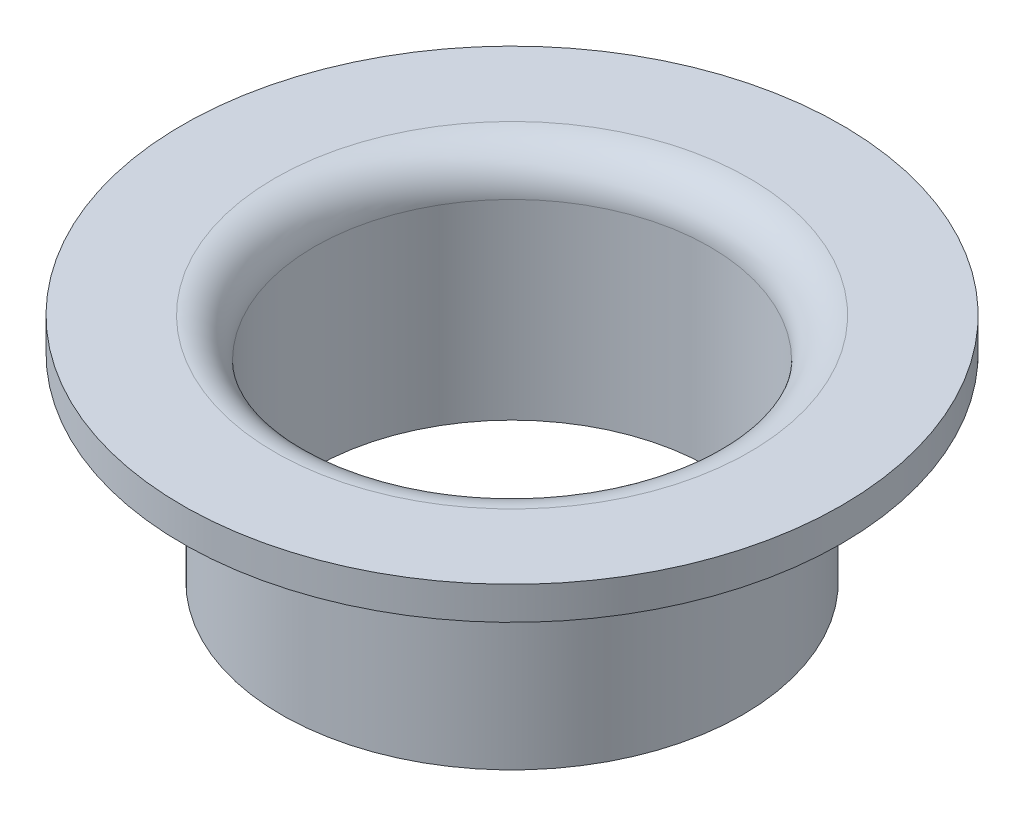
ISO-10303-21;
HEADER;
FILE_DESCRIPTION(('STEP AP214'),'2;1');
FILE_NAME('part.step','',(''),(''),'','','');
FILE_SCHEMA(('AUTOMOTIVE_DESIGN { 1 0 10303 214 1 1 1 1 }'));
ENDSEC;
DATA;
#1=APPLICATION_CONTEXT('core data for automotive mechanical design processes');
#2=APPLICATION_PROTOCOL_DEFINITION('international standard','automotive_design',2000,#1);
#3=PRODUCT_CONTEXT('',#1,'mechanical');
#4=PRODUCT('Part','Part','',(#3));
#5=PRODUCT_RELATED_PRODUCT_CATEGORY('part','',(#4));
#6=PRODUCT_DEFINITION_FORMATION('','',#4);
#7=PRODUCT_DEFINITION_CONTEXT('part definition',#1,'design');
#8=PRODUCT_DEFINITION('design','',#6,#7);
#9=PRODUCT_DEFINITION_SHAPE('','',#8);
#10=(LENGTH_UNIT() NAMED_UNIT(*) SI_UNIT(.MILLI.,.METRE.));
#11=(NAMED_UNIT(*) PLANE_ANGLE_UNIT() SI_UNIT($,.RADIAN.));
#12=(NAMED_UNIT(*) SI_UNIT($,.STERADIAN.) SOLID_ANGLE_UNIT());
#13=UNCERTAINTY_MEASURE_WITH_UNIT(LENGTH_MEASURE(1.E-05),#10,'distance_accuracy_value','');
#14=(GEOMETRIC_REPRESENTATION_CONTEXT(3) GLOBAL_UNCERTAINTY_ASSIGNED_CONTEXT((#13)) GLOBAL_UNIT_ASSIGNED_CONTEXT((#10,
#11,#12)) REPRESENTATION_CONTEXT('',''));
#15=CARTESIAN_POINT('',(0.,0.,0.));
#16=DIRECTION('',(0.,0.,1.));
#17=DIRECTION('',(1.,0.,0.));
#18=AXIS2_PLACEMENT_3D('',#15,#16,#17);
#19=CARTESIAN_POINT('',(1705.40144360175,541.99983296363,1021.10142128041));
#20=DIRECTION('',(-7.26398037315937E-05,-0.999999997361588,-5.31510700683623E-07));
#21=DIRECTION('',(0.99999999736173,-7.2639803731604E-05,0.));
#22=AXIS2_PLACEMENT_3D('',#19,#20,#21);
#23=CYLINDRICAL_SURFACE('',#22,9.99999999997917);
#24=CARTESIAN_POINT('',(1705.40144354579,541.999062458682,1021.10142128));
#25=DIRECTION('',(-7.26398037315937E-05,-0.999999997361588,-5.31510700683623E-07));
#26=DIRECTION('',(0.99999999736173,-7.2639803731604E-05,0.));
#27=AXIS2_PLACEMENT_3D('',#24,#25,#26);
#28=CIRCLE('',#27,9.99999999997927);
#29=CARTESIAN_POINT('',(1715.40144351938,541.998336060644,1021.10142128));
#30=VERTEX_POINT('',#29);
#31=EDGE_CURVE('E57',#30,#30,#28,.T.);
#32=ORIENTED_EDGE('',*,*,#31,.T.);
#33=EDGE_LOOP('',(#32));
#34=FACE_BOUND('',#33,.T.);
#35=CARTESIAN_POINT('',(1705.40137090598,540.99906246132,1021.10142074849));
#36=DIRECTION('',(-7.26398037315937E-05,-0.999999997361588,-5.31510700683623E-07));
#37=DIRECTION('',(0.99999999736173,-7.2639803731604E-05,0.));
#38=AXIS2_PLACEMENT_3D('',#35,#36,#37);
#39=CIRCLE('',#38,9.99999999997927);
#40=CARTESIAN_POINT('',(1715.40137087958,540.998336063283,1021.10142074849));
#41=VERTEX_POINT('',#40);
#42=EDGE_CURVE('E48',#41,#41,#39,.T.);
#43=ORIENTED_EDGE('',*,*,#42,.F.);
#44=EDGE_LOOP('',(#43));
#45=FACE_BOUND('',#44,.T.);
#46=ADVANCED_FACE('F29',(#34,#45),#23,.T.);
#47=CARTESIAN_POINT('',(1712.4013708875,540.998553982694,1021.10142074822));
#48=DIRECTION('',(-7.26398037315937E-05,-0.999999997361588,-5.31510700683623E-07));
#49=DIRECTION('',(0.99999999736173,-7.2639803731604E-05,0.));
#50=AXIS2_PLACEMENT_3D('',#47,#48,#49);
#51=PLANE('',#50);
#52=CARTESIAN_POINT('',(1705.40137090598,540.99906246132,1021.10142074849));
#53=DIRECTION('',(-7.26398037315937E-05,-0.999999997361588,-5.31510700683623E-07));
#54=DIRECTION('',(0.99999999736173,-7.2639803731604E-05,0.));
#55=AXIS2_PLACEMENT_3D('',#52,#53,#54);
#56=CIRCLE('',#55,7.19999999998979);
#57=CARTESIAN_POINT('',(1712.60137088698,540.998539454733,1021.10142074849));
#58=VERTEX_POINT('',#57);
#59=EDGE_CURVE('E39',#58,#58,#56,.F.);
#60=ORIENTED_EDGE('',*,*,#59,.T.);
#61=EDGE_LOOP('',(#60));
#62=FACE_BOUND('',#61,.T.);
#63=ORIENTED_EDGE('',*,*,#42,.T.);
#64=EDGE_LOOP('',(#63));
#65=FACE_BOUND('',#64,.T.);
#66=ADVANCED_FACE('F78',(#62,#65),#51,.T.);
#67=CARTESIAN_POINT('',(1705.40144360175,541.99983296363,1021.10142128041));
#68=DIRECTION('',(-7.26398037315937E-05,-0.999999997361588,-5.31510700683623E-07));
#69=DIRECTION('',(0.99999999736173,-7.2639803731604E-05,0.));
#70=AXIS2_PLACEMENT_3D('',#67,#68,#69);
#71=CYLINDRICAL_SURFACE('',#70,6.99999999998979);
#72=CARTESIAN_POINT('',(1705.40135637802,540.799062461848,1021.10142064219));
#73=DIRECTION('',(-7.26398037315937E-05,-0.999999997361588,-5.31510700683623E-07));
#74=DIRECTION('',(0.99999999736173,-7.2639803731604E-05,0.));
#75=AXIS2_PLACEMENT_3D('',#72,#73,#74);
#76=CIRCLE('',#75,6.99999999998979);
#77=CARTESIAN_POINT('',(1712.40135635954,540.798553983221,1021.10142064219));
#78=VERTEX_POINT('',#77);
#79=EDGE_CURVE('E43',#78,#78,#76,.T.);
#80=ORIENTED_EDGE('',*,*,#79,.T.);
#81=EDGE_LOOP('',(#80));
#82=FACE_BOUND('',#81,.T.);
#83=CARTESIAN_POINT('',(1705.40093506716,534.99906247715,1021.10141755942));
#84=DIRECTION('',(-7.26398037315937E-05,-0.999999997361588,-5.31510700683623E-07));
#85=DIRECTION('',(0.99999999736173,-7.2639803731604E-05,0.));
#86=AXIS2_PLACEMENT_3D('',#83,#84,#85);
#87=CIRCLE('',#86,6.99999999998981);
#88=CARTESIAN_POINT('',(1712.40093504868,534.998553998524,1021.10141755942));
#89=VERTEX_POINT('',#88);
#90=EDGE_CURVE('E51',#89,#89,#87,.T.);
#91=ORIENTED_EDGE('',*,*,#90,.F.);
#92=EDGE_LOOP('',(#91));
#93=FACE_BOUND('',#92,.T.);
#94=ADVANCED_FACE('F82',(#82,#93),#71,.T.);
#95=CARTESIAN_POINT('',(1711.40093505132,534.998626638328,1021.10141755919));
#96=DIRECTION('',(-7.26398037315937E-05,-0.999999997361588,-5.31510700683623E-07));
#97=DIRECTION('',(0.99999999736173,-7.2639803731604E-05,0.));
#98=AXIS2_PLACEMENT_3D('',#95,#96,#97);
#99=PLANE('',#98);
#100=ORIENTED_EDGE('',*,*,#90,.T.);
#101=EDGE_LOOP('',(#100));
#102=FACE_BOUND('',#101,.T.);
#103=CARTESIAN_POINT('',(1705.40093506716,534.99906247715,1021.10141755942));
#104=DIRECTION('',(-7.26398037315937E-05,-0.999999997361588,-5.31510700683623E-07));
#105=DIRECTION('',(0.99999999736173,-7.2639803731604E-05,0.));
#106=AXIS2_PLACEMENT_3D('',#103,#104,#105);
#107=CIRCLE('',#106,5.99999999998887);
#108=CARTESIAN_POINT('',(1711.40093505132,534.998626638328,1021.10141755942));
#109=VERTEX_POINT('',#108);
#110=EDGE_CURVE('E54',#109,#109,#107,.T.);
#111=ORIENTED_EDGE('',*,*,#110,.F.);
#112=EDGE_LOOP('',(#111));
#113=FACE_BOUND('',#112,.T.);
#114=ADVANCED_FACE('F75',(#102,#113),#99,.T.);
#115=CARTESIAN_POINT('',(1705.40144360175,541.99983296363,1021.10142128041));
#116=DIRECTION('',(-7.26398037315937E-05,-0.999999997361588,-5.31510700683623E-07));
#117=DIRECTION('',(0.99999999736173,-7.2639803731604E-05,0.));
#118=AXIS2_PLACEMENT_3D('',#115,#116,#117);
#119=CYLINDRICAL_SURFACE('',#118,5.99999999998886);
#120=CARTESIAN_POINT('',(1705.40135637802,540.799062461848,1021.10142064219));
#121=DIRECTION('',(7.26398037315937E-05,0.999999997361588,5.31510700683623E-07));
#122=DIRECTION('',(-0.99999999736173,7.2639803731604E-05,0.));
#123=AXIS2_PLACEMENT_3D('',#120,#121,#122);
#124=CIRCLE('',#123,5.99999999998886);
#125=CARTESIAN_POINT('',(1699.40135639386,540.79949830067,1021.10142064219));
#126=VERTEX_POINT('',#125);
#127=EDGE_CURVE('E10',#126,#126,#124,.T.);
#128=ORIENTED_EDGE('',*,*,#127,.T.);
#129=EDGE_LOOP('',(#128));
#130=FACE_BOUND('',#129,.T.);
#131=ORIENTED_EDGE('',*,*,#110,.T.);
#132=EDGE_LOOP('',(#131));
#133=FACE_BOUND('',#132,.T.);
#134=ADVANCED_FACE('F66',(#130,#133),#119,.F.);
#135=CARTESIAN_POINT('',(1715.40144351938,541.998336060644,1021.10142127961));
#136=DIRECTION('',(7.26398037315937E-05,0.999999997361588,5.31510700683623E-07));
#137=DIRECTION('',(-0.99999999736173,7.2639803731604E-05,0.));
#138=AXIS2_PLACEMENT_3D('',#135,#136,#137);
#139=PLANE('',#138);
#140=CARTESIAN_POINT('',(1705.40144354579,541.999062458682,1021.10142128));
#141=DIRECTION('',(7.26398037315937E-05,0.999999997361588,5.31510700683623E-07));
#142=DIRECTION('',(-0.99999999736173,7.2639803731604E-05,0.));
#143=AXIS2_PLACEMENT_3D('',#140,#141,#142);
#144=CIRCLE('',#143,7.19999999998886);
#145=CARTESIAN_POINT('',(1698.20144356479,541.999585465268,1021.10142128));
#146=VERTEX_POINT('',#145);
#147=EDGE_CURVE('E35',#146,#146,#144,.F.);
#148=ORIENTED_EDGE('',*,*,#147,.T.);
#149=EDGE_LOOP('',(#148));
#150=FACE_BOUND('',#149,.T.);
#151=ORIENTED_EDGE('',*,*,#31,.F.);
#152=EDGE_LOOP('',(#151));
#153=FACE_BOUND('',#152,.T.);
#154=ADVANCED_FACE('F63',(#150,#153),#139,.T.);
#155=CARTESIAN_POINT('',(1705.40135637802,540.799062461848,1021.10142064219));
#156=DIRECTION('',(-7.26398037315937E-05,-0.999999997361588,-5.31510700683623E-07));
#157=DIRECTION('',(0.99999999736173,-7.2639803731604E-05,0.));
#158=AXIS2_PLACEMENT_3D('',#155,#156,#157);
#159=TOROIDAL_SURFACE('',#158,7.19999999998979,0.2);
#160=ORIENTED_EDGE('',*,*,#59,.F.);
#161=EDGE_LOOP('',(#160));
#162=FACE_BOUND('',#161,.T.);
#163=ORIENTED_EDGE('',*,*,#79,.F.);
#164=EDGE_LOOP('',(#163));
#165=FACE_BOUND('',#164,.T.);
#166=ADVANCED_FACE('F65',(#162,#165),#159,.F.);
#167=CARTESIAN_POINT('',(1705.40135637802,540.799062461848,1021.10142064219));
#168=DIRECTION('',(7.26398037315937E-05,0.999999997361588,5.31510700683623E-07));
#169=DIRECTION('',(-0.99999999736173,7.2639803731604E-05,0.));
#170=AXIS2_PLACEMENT_3D('',#167,#168,#169);
#171=TOROIDAL_SURFACE('',#170,7.19999999998886,1.2);
#172=ORIENTED_EDGE('',*,*,#127,.F.);
#173=EDGE_LOOP('',(#172));
#174=FACE_BOUND('',#173,.T.);
#175=ORIENTED_EDGE('',*,*,#147,.F.);
#176=EDGE_LOOP('',(#175));
#177=FACE_BOUND('',#176,.T.);
#178=ADVANCED_FACE('F72',(#174,#177),#171,.T.);
#179=CLOSED_SHELL('',(#46,#66,#94,#114,#134,#154,#166,#178));
#180=MANIFOLD_SOLID_BREP('B2',#179);
#181=ADVANCED_BREP_SHAPE_REPRESENTATION('',(#18,#180),#14);
#182=SHAPE_DEFINITION_REPRESENTATION(#9,#181);
ENDSEC;
END-ISO-10303-21;
